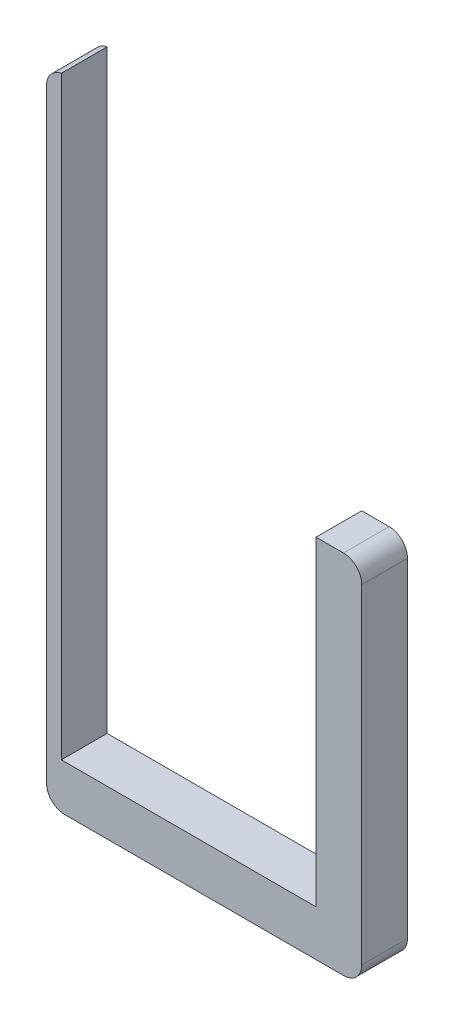
ISO-10303-21;
HEADER;
FILE_DESCRIPTION(('STEP AP214'),'2;1');
FILE_NAME('part.step','',(''),(''),'','','');
FILE_SCHEMA(('AUTOMOTIVE_DESIGN { 1 0 10303 214 1 1 1 1 }'));
ENDSEC;
DATA;
#1=APPLICATION_CONTEXT('core data for automotive mechanical design processes');
#2=APPLICATION_PROTOCOL_DEFINITION('international standard','automotive_design',2000,#1);
#3=PRODUCT_CONTEXT('',#1,'mechanical');
#4=PRODUCT('Part','Part','',(#3));
#5=PRODUCT_RELATED_PRODUCT_CATEGORY('part','',(#4));
#6=PRODUCT_DEFINITION_FORMATION('','',#4);
#7=PRODUCT_DEFINITION_CONTEXT('part definition',#1,'design');
#8=PRODUCT_DEFINITION('design','',#6,#7);
#9=PRODUCT_DEFINITION_SHAPE('','',#8);
#10=(LENGTH_UNIT() NAMED_UNIT(*) SI_UNIT(.MILLI.,.METRE.));
#11=(NAMED_UNIT(*) PLANE_ANGLE_UNIT() SI_UNIT($,.RADIAN.));
#12=(NAMED_UNIT(*) SI_UNIT($,.STERADIAN.) SOLID_ANGLE_UNIT());
#13=UNCERTAINTY_MEASURE_WITH_UNIT(LENGTH_MEASURE(1.E-05),#10,'distance_accuracy_value','');
#14=(GEOMETRIC_REPRESENTATION_CONTEXT(3) GLOBAL_UNCERTAINTY_ASSIGNED_CONTEXT((#13)) GLOBAL_UNIT_ASSIGNED_CONTEXT((#10,
#11,#12)) REPRESENTATION_CONTEXT('',''));
#15=CARTESIAN_POINT('',(0.,0.,0.));
#16=DIRECTION('',(0.,0.,1.));
#17=DIRECTION('',(1.,0.,0.));
#18=AXIS2_PLACEMENT_3D('',#15,#16,#17);
#19=CARTESIAN_POINT('',(0.,82.55,6.35));
#20=DIRECTION('',(-1.,0.,0.));
#21=DIRECTION('',(0.,-1.,0.));
#22=AXIS2_PLACEMENT_3D('',#19,#20,#21);
#23=PLANE('',#22);
#24=DIRECTION('',(0.,1.,0.));
#25=VECTOR('',#24,1.);
#26=CARTESIAN_POINT('',(0.,82.55,0.));
#27=LINE('',#26,#25);
#28=CARTESIAN_POINT('',(0.,0.,0.));
#29=VERTEX_POINT('',#28);
#30=CARTESIAN_POINT('',(0.,82.55,0.));
#31=VERTEX_POINT('',#30);
#32=EDGE_CURVE('E142',#29,#31,#27,.T.);
#33=ORIENTED_EDGE('',*,*,#32,.T.);
#34=DIRECTION('',(0.,0.,-1.));
#35=VECTOR('',#34,1.);
#36=CARTESIAN_POINT('',(0.,82.55,6.35));
#37=LINE('',#36,#35);
#38=CARTESIAN_POINT('',(0.,82.55,6.35));
#39=VERTEX_POINT('',#38);
#40=EDGE_CURVE('E140',#39,#31,#37,.T.);
#41=ORIENTED_EDGE('',*,*,#40,.F.);
#42=DIRECTION('',(0.,1.,0.));
#43=VECTOR('',#42,1.);
#44=CARTESIAN_POINT('',(0.,82.55,6.35));
#45=LINE('',#44,#43);
#46=CARTESIAN_POINT('',(0.,0.,6.35));
#47=VERTEX_POINT('',#46);
#48=EDGE_CURVE('E122',#47,#39,#45,.T.);
#49=ORIENTED_EDGE('',*,*,#48,.F.);
#50=DIRECTION('',(0.,0.,-1.));
#51=VECTOR('',#50,1.);
#52=CARTESIAN_POINT('',(0.,0.,6.35));
#53=LINE('',#52,#51);
#54=EDGE_CURVE('E200',#47,#29,#53,.T.);
#55=ORIENTED_EDGE('',*,*,#54,.T.);
#56=EDGE_LOOP('',(#33,#41,#49,#55));
#57=FACE_BOUND('',#56,.T.);
#58=ADVANCED_FACE('F39',(#57),#23,.F.);
#59=CARTESIAN_POINT('',(-2.05739999999998,-6.35000000000001,6.35));
#60=DIRECTION('',(1.,0.,0.));
#61=DIRECTION('',(0.,1.,0.));
#62=AXIS2_PLACEMENT_3D('',#59,#60,#61);
#63=PLANE('',#62);
#64=DIRECTION('',(0.,-1.,0.));
#65=VECTOR('',#64,1.);
#66=CARTESIAN_POINT('',(-2.05739999999998,-6.35000000000001,6.35));
#67=LINE('',#66,#65);
#68=CARTESIAN_POINT('',(-2.0574,80.0562684105943,6.35));
#69=VERTEX_POINT('',#68);
#70=CARTESIAN_POINT('',(-2.05739999999998,-3.81000000000001,6.35));
#71=VERTEX_POINT('',#70);
#72=EDGE_CURVE('E135',#69,#71,#67,.T.);
#73=ORIENTED_EDGE('',*,*,#72,.F.);
#74=DIRECTION('',(0.,0.,-1.));
#75=VECTOR('',#74,1.);
#76=CARTESIAN_POINT('',(-2.0574,80.0562684105943,6.35));
#77=LINE('',#76,#75);
#78=CARTESIAN_POINT('',(-2.0574,80.0562684105943,0.));
#79=VERTEX_POINT('',#78);
#80=EDGE_CURVE('E151',#69,#79,#77,.T.);
#81=ORIENTED_EDGE('',*,*,#80,.T.);
#82=DIRECTION('',(0.,-1.,0.));
#83=VECTOR('',#82,1.);
#84=CARTESIAN_POINT('',(-2.05739999999998,-6.35000000000001,0.));
#85=LINE('',#84,#83);
#86=CARTESIAN_POINT('',(-2.05739999999998,-3.81000000000001,0.));
#87=VERTEX_POINT('',#86);
#88=EDGE_CURVE('E171',#79,#87,#85,.T.);
#89=ORIENTED_EDGE('',*,*,#88,.T.);
#90=DIRECTION('',(0.,0.,-1.));
#91=VECTOR('',#90,1.);
#92=CARTESIAN_POINT('',(-2.05739999999998,-3.81000000000001,6.35));
#93=LINE('',#92,#91);
#94=EDGE_CURVE('E157',#87,#71,#93,.F.);
#95=ORIENTED_EDGE('',*,*,#94,.T.);
#96=EDGE_LOOP('',(#73,#81,#89,#95));
#97=FACE_BOUND('',#96,.T.);
#98=ADVANCED_FACE('F170',(#97),#63,.F.);
#99=CARTESIAN_POINT('',(41.7068,-6.35000000000002,6.35));
#100=DIRECTION('',(0.,1.,0.));
#101=DIRECTION('',(-1.,0.,0.));
#102=AXIS2_PLACEMENT_3D('',#99,#100,#101);
#103=PLANE('',#102);
#104=DIRECTION('',(1.,0.,0.));
#105=VECTOR('',#104,1.);
#106=CARTESIAN_POINT('',(41.7068,-6.35000000000002,6.35));
#107=LINE('',#106,#105);
#108=CARTESIAN_POINT('',(0.482600000000014,-6.35000000000001,6.35));
#109=VERTEX_POINT('',#108);
#110=CARTESIAN_POINT('',(39.1668,-6.35000000000002,6.35));
#111=VERTEX_POINT('',#110);
#112=EDGE_CURVE('E234',#109,#111,#107,.T.);
#113=ORIENTED_EDGE('',*,*,#112,.F.);
#114=DIRECTION('',(0.,0.,-1.));
#115=VECTOR('',#114,1.);
#116=CARTESIAN_POINT('',(0.482600000000014,-6.35000000000001,6.35));
#117=LINE('',#116,#115);
#118=CARTESIAN_POINT('',(0.482600000000014,-6.35000000000001,0.));
#119=VERTEX_POINT('',#118);
#120=EDGE_CURVE('E11',#109,#119,#117,.T.);
#121=ORIENTED_EDGE('',*,*,#120,.T.);
#122=DIRECTION('',(1.,0.,0.));
#123=VECTOR('',#122,1.);
#124=CARTESIAN_POINT('',(41.7068,-6.35000000000002,0.));
#125=LINE('',#124,#123);
#126=CARTESIAN_POINT('',(39.1668,-6.35000000000002,0.));
#127=VERTEX_POINT('',#126);
#128=EDGE_CURVE('E180',#119,#127,#125,.T.);
#129=ORIENTED_EDGE('',*,*,#128,.T.);
#130=DIRECTION('',(0.,0.,-1.));
#131=VECTOR('',#130,1.);
#132=CARTESIAN_POINT('',(39.1668,-6.35000000000002,6.35));
#133=LINE('',#132,#131);
#134=EDGE_CURVE('E48',#127,#111,#133,.F.);
#135=ORIENTED_EDGE('',*,*,#134,.T.);
#136=EDGE_LOOP('',(#113,#121,#129,#135));
#137=FACE_BOUND('',#136,.T.);
#138=ADVANCED_FACE('F244',(#137),#103,.F.);
#139=CARTESIAN_POINT('',(41.7068,44.45,6.35));
#140=DIRECTION('',(-1.,0.,0.));
#141=DIRECTION('',(0.,-1.,0.));
#142=AXIS2_PLACEMENT_3D('',#139,#140,#141);
#143=PLANE('',#142);
#144=DIRECTION('',(0.,1.,0.));
#145=VECTOR('',#144,1.);
#146=CARTESIAN_POINT('',(41.7068,44.45,0.));
#147=LINE('',#146,#145);
#148=CARTESIAN_POINT('',(41.7068,-3.81000000000002,0.));
#149=VERTEX_POINT('',#148);
#150=CARTESIAN_POINT('',(41.7068,41.91,0.));
#151=VERTEX_POINT('',#150);
#152=EDGE_CURVE('E184',#149,#151,#147,.T.);
#153=ORIENTED_EDGE('',*,*,#152,.T.);
#154=DIRECTION('',(0.,0.,-1.));
#155=VECTOR('',#154,1.);
#156=CARTESIAN_POINT('',(41.7068,41.91,6.35));
#157=LINE('',#156,#155);
#158=CARTESIAN_POINT('',(41.7068,41.91,6.35));
#159=VERTEX_POINT('',#158);
#160=EDGE_CURVE('E227',#151,#159,#157,.F.);
#161=ORIENTED_EDGE('',*,*,#160,.T.);
#162=DIRECTION('',(0.,1.,0.));
#163=VECTOR('',#162,1.);
#164=CARTESIAN_POINT('',(41.7068,44.45,6.35));
#165=LINE('',#164,#163);
#166=CARTESIAN_POINT('',(41.7068,-3.81000000000002,6.35));
#167=VERTEX_POINT('',#166);
#168=EDGE_CURVE('E232',#167,#159,#165,.T.);
#169=ORIENTED_EDGE('',*,*,#168,.F.);
#170=DIRECTION('',(0.,0.,-1.));
#171=VECTOR('',#170,1.);
#172=CARTESIAN_POINT('',(41.7068,-3.81000000000002,6.35));
#173=LINE('',#172,#171);
#174=EDGE_CURVE('E223',#167,#149,#173,.T.);
#175=ORIENTED_EDGE('',*,*,#174,.T.);
#176=EDGE_LOOP('',(#153,#161,#169,#175));
#177=FACE_BOUND('',#176,.T.);
#178=ADVANCED_FACE('F238',(#177),#143,.F.);
#179=CARTESIAN_POINT('',(35.3568,44.45,6.35));
#180=DIRECTION('',(0.,-1.,0.));
#181=DIRECTION('',(0.,0.,-1.));
#182=AXIS2_PLACEMENT_3D('',#179,#180,#181);
#183=PLANE('',#182);
#184=DIRECTION('',(-1.,0.,0.));
#185=VECTOR('',#184,1.);
#186=CARTESIAN_POINT('',(35.3568,44.45,6.35));
#187=LINE('',#186,#185);
#188=CARTESIAN_POINT('',(39.1668,44.45,6.35));
#189=VERTEX_POINT('',#188);
#190=CARTESIAN_POINT('',(35.3568,44.45,6.35));
#191=VERTEX_POINT('',#190);
#192=EDGE_CURVE('E242',#189,#191,#187,.T.);
#193=ORIENTED_EDGE('',*,*,#192,.F.);
#194=DIRECTION('',(0.,0.,-1.));
#195=VECTOR('',#194,1.);
#196=CARTESIAN_POINT('',(39.1668,44.45,6.35));
#197=LINE('',#196,#195);
#198=CARTESIAN_POINT('',(39.1668,44.45,0.));
#199=VERTEX_POINT('',#198);
#200=EDGE_CURVE('E145',#189,#199,#197,.T.);
#201=ORIENTED_EDGE('',*,*,#200,.T.);
#202=DIRECTION('',(-1.,0.,0.));
#203=VECTOR('',#202,1.);
#204=CARTESIAN_POINT('',(35.3568,44.45,0.));
#205=LINE('',#204,#203);
#206=CARTESIAN_POINT('',(35.3568,44.45,0.));
#207=VERTEX_POINT('',#206);
#208=EDGE_CURVE('E192',#199,#207,#205,.T.);
#209=ORIENTED_EDGE('',*,*,#208,.T.);
#210=DIRECTION('',(0.,0.,-1.));
#211=VECTOR('',#210,1.);
#212=CARTESIAN_POINT('',(35.3568,44.45,6.35));
#213=LINE('',#212,#211);
#214=EDGE_CURVE('E146',#191,#207,#213,.T.);
#215=ORIENTED_EDGE('',*,*,#214,.F.);
#216=EDGE_LOOP('',(#193,#201,#209,#215));
#217=FACE_BOUND('',#216,.T.);
#218=ADVANCED_FACE('F269',(#217),#183,.F.);
#219=CARTESIAN_POINT('',(35.3568,0.,6.35));
#220=DIRECTION('',(1.,0.,0.));
#221=DIRECTION('',(0.,1.,0.));
#222=AXIS2_PLACEMENT_3D('',#219,#220,#221);
#223=PLANE('',#222);
#224=DIRECTION('',(0.,-1.,0.));
#225=VECTOR('',#224,1.);
#226=CARTESIAN_POINT('',(35.3568,0.,0.));
#227=LINE('',#226,#225);
#228=CARTESIAN_POINT('',(35.3568,0.,0.));
#229=VERTEX_POINT('',#228);
#230=EDGE_CURVE('E195',#207,#229,#227,.T.);
#231=ORIENTED_EDGE('',*,*,#230,.T.);
#232=DIRECTION('',(0.,0.,-1.));
#233=VECTOR('',#232,1.);
#234=CARTESIAN_POINT('',(35.3568,0.,6.35));
#235=LINE('',#234,#233);
#236=CARTESIAN_POINT('',(35.3568,0.,6.35));
#237=VERTEX_POINT('',#236);
#238=EDGE_CURVE('E203',#237,#229,#235,.T.);
#239=ORIENTED_EDGE('',*,*,#238,.F.);
#240=DIRECTION('',(0.,-1.,0.));
#241=VECTOR('',#240,1.);
#242=CARTESIAN_POINT('',(35.3568,0.,6.35));
#243=LINE('',#242,#241);
#244=EDGE_CURVE('E255',#191,#237,#243,.T.);
#245=ORIENTED_EDGE('',*,*,#244,.F.);
#246=ORIENTED_EDGE('',*,*,#214,.T.);
#247=EDGE_LOOP('',(#231,#239,#245,#246));
#248=FACE_BOUND('',#247,.T.);
#249=ADVANCED_FACE('F263',(#248),#223,.F.);
#250=CARTESIAN_POINT('',(0.,0.,6.35));
#251=DIRECTION('',(0.,-1.,0.));
#252=DIRECTION('',(0.,0.,-1.));
#253=AXIS2_PLACEMENT_3D('',#250,#251,#252);
#254=PLANE('',#253);
#255=DIRECTION('',(-1.,0.,0.));
#256=VECTOR('',#255,1.);
#257=CARTESIAN_POINT('',(0.,0.,0.));
#258=LINE('',#257,#256);
#259=EDGE_CURVE('E136',#229,#29,#258,.T.);
#260=ORIENTED_EDGE('',*,*,#259,.T.);
#261=ORIENTED_EDGE('',*,*,#54,.F.);
#262=DIRECTION('',(-1.,0.,0.));
#263=VECTOR('',#262,1.);
#264=CARTESIAN_POINT('',(0.,0.,6.35));
#265=LINE('',#264,#263);
#266=EDGE_CURVE('E130',#237,#47,#265,.T.);
#267=ORIENTED_EDGE('',*,*,#266,.F.);
#268=ORIENTED_EDGE('',*,*,#238,.T.);
#269=EDGE_LOOP('',(#260,#261,#267,#268));
#270=FACE_BOUND('',#269,.T.);
#271=ADVANCED_FACE('F267',(#270),#254,.F.);
#272=CARTESIAN_POINT('',(0.,0.,6.35));
#273=DIRECTION('',(0.,0.,1.));
#274=DIRECTION('',(1.,0.,0.));
#275=AXIS2_PLACEMENT_3D('',#272,#273,#274);
#276=PLANE('',#275);
#277=ORIENTED_EDGE('',*,*,#168,.T.);
#278=CARTESIAN_POINT('',(39.1668,41.91,6.35));
#279=DIRECTION('',(0.,0.,1.));
#280=DIRECTION('',(1.,0.,0.));
#281=AXIS2_PLACEMENT_3D('',#278,#279,#280);
#282=CIRCLE('',#281,2.54);
#283=EDGE_CURVE('E153',#159,#189,#282,.T.);
#284=ORIENTED_EDGE('',*,*,#283,.T.);
#285=ORIENTED_EDGE('',*,*,#192,.T.);
#286=ORIENTED_EDGE('',*,*,#244,.T.);
#287=ORIENTED_EDGE('',*,*,#266,.T.);
#288=ORIENTED_EDGE('',*,*,#48,.T.);
#289=CARTESIAN_POINT('',(0.482599999999996,80.0562684105943,6.35));
#290=DIRECTION('',(0.,0.,1.));
#291=DIRECTION('',(1.,0.,0.));
#292=AXIS2_PLACEMENT_3D('',#289,#290,#291);
#293=CIRCLE('',#292,2.54);
#294=EDGE_CURVE('E127',#39,#69,#293,.T.);
#295=ORIENTED_EDGE('',*,*,#294,.T.);
#296=ORIENTED_EDGE('',*,*,#72,.T.);
#297=CARTESIAN_POINT('',(0.482600000000014,-3.81000000000001,6.35));
#298=DIRECTION('',(0.,0.,1.));
#299=DIRECTION('',(1.,0.,0.));
#300=AXIS2_PLACEMENT_3D('',#297,#298,#299);
#301=CIRCLE('',#300,2.54);
#302=EDGE_CURVE('E61',#71,#109,#301,.T.);
#303=ORIENTED_EDGE('',*,*,#302,.T.);
#304=ORIENTED_EDGE('',*,*,#112,.T.);
#305=CARTESIAN_POINT('',(39.1668,-3.81000000000002,6.35));
#306=DIRECTION('',(0.,0.,1.));
#307=DIRECTION('',(1.,0.,0.));
#308=AXIS2_PLACEMENT_3D('',#305,#306,#307);
#309=CIRCLE('',#308,2.54);
#310=EDGE_CURVE('E159',#111,#167,#309,.T.);
#311=ORIENTED_EDGE('',*,*,#310,.T.);
#312=EDGE_LOOP('',(#277,#284,#285,#286,#287,#288,#295,#296,#303,#304,#311));
#313=FACE_BOUND('',#312,.T.);
#314=ADVANCED_FACE('F125',(#313),#276,.T.);
#315=CARTESIAN_POINT('',(0.,0.,0.));
#316=DIRECTION('',(0.,0.,1.));
#317=DIRECTION('',(1.,0.,0.));
#318=AXIS2_PLACEMENT_3D('',#315,#316,#317);
#319=PLANE('',#318);
#320=ORIENTED_EDGE('',*,*,#208,.F.);
#321=CARTESIAN_POINT('',(39.1668,41.91,0.));
#322=DIRECTION('',(0.,0.,1.));
#323=DIRECTION('',(1.,0.,0.));
#324=AXIS2_PLACEMENT_3D('',#321,#322,#323);
#325=CIRCLE('',#324,2.54);
#326=EDGE_CURVE('E220',#199,#151,#325,.F.);
#327=ORIENTED_EDGE('',*,*,#326,.T.);
#328=ORIENTED_EDGE('',*,*,#152,.F.);
#329=CARTESIAN_POINT('',(39.1668,-3.81000000000002,0.));
#330=DIRECTION('',(0.,0.,1.));
#331=DIRECTION('',(1.,0.,0.));
#332=AXIS2_PLACEMENT_3D('',#329,#330,#331);
#333=CIRCLE('',#332,2.54);
#334=EDGE_CURVE('E213',#149,#127,#333,.F.);
#335=ORIENTED_EDGE('',*,*,#334,.T.);
#336=ORIENTED_EDGE('',*,*,#128,.F.);
#337=CARTESIAN_POINT('',(0.482600000000014,-3.81000000000001,0.));
#338=DIRECTION('',(0.,0.,1.));
#339=DIRECTION('',(1.,0.,0.));
#340=AXIS2_PLACEMENT_3D('',#337,#338,#339);
#341=CIRCLE('',#340,2.54);
#342=EDGE_CURVE('E178',#119,#87,#341,.F.);
#343=ORIENTED_EDGE('',*,*,#342,.T.);
#344=ORIENTED_EDGE('',*,*,#88,.F.);
#345=CARTESIAN_POINT('',(0.482599999999996,80.0562684105943,0.));
#346=DIRECTION('',(0.,0.,1.));
#347=DIRECTION('',(1.,0.,0.));
#348=AXIS2_PLACEMENT_3D('',#345,#346,#347);
#349=CIRCLE('',#348,2.54);
#350=EDGE_CURVE('E176',#79,#31,#349,.F.);
#351=ORIENTED_EDGE('',*,*,#350,.T.);
#352=ORIENTED_EDGE('',*,*,#32,.F.);
#353=ORIENTED_EDGE('',*,*,#259,.F.);
#354=ORIENTED_EDGE('',*,*,#230,.F.);
#355=EDGE_LOOP('',(#320,#327,#328,#335,#336,#343,#344,#351,#352,#353,#354));
#356=FACE_BOUND('',#355,.T.);
#357=ADVANCED_FACE('F175',(#356),#319,.F.);
#358=CARTESIAN_POINT('',(39.1668,41.91,6.35));
#359=DIRECTION('',(0.,0.,-1.));
#360=DIRECTION('',(-1.,0.,0.));
#361=AXIS2_PLACEMENT_3D('',#358,#359,#360);
#362=CYLINDRICAL_SURFACE('',#361,2.54);
#363=ORIENTED_EDGE('',*,*,#283,.F.);
#364=ORIENTED_EDGE('',*,*,#160,.F.);
#365=ORIENTED_EDGE('',*,*,#326,.F.);
#366=ORIENTED_EDGE('',*,*,#200,.F.);
#367=EDGE_LOOP('',(#363,#364,#365,#366));
#368=FACE_BOUND('',#367,.T.);
#369=ADVANCED_FACE('F272',(#368),#362,.T.);
#370=CARTESIAN_POINT('',(0.482599999999996,80.0562684105943,6.35));
#371=DIRECTION('',(0.,0.,-1.));
#372=DIRECTION('',(-1.,0.,0.));
#373=AXIS2_PLACEMENT_3D('',#370,#371,#372);
#374=CYLINDRICAL_SURFACE('',#373,2.54);
#375=ORIENTED_EDGE('',*,*,#294,.F.);
#376=ORIENTED_EDGE('',*,*,#40,.T.);
#377=ORIENTED_EDGE('',*,*,#350,.F.);
#378=ORIENTED_EDGE('',*,*,#80,.F.);
#379=EDGE_LOOP('',(#375,#376,#377,#378));
#380=FACE_BOUND('',#379,.T.);
#381=ADVANCED_FACE('F149',(#380),#374,.T.);
#382=CARTESIAN_POINT('',(0.482600000000014,-3.81000000000001,6.35));
#383=DIRECTION('',(0.,0.,-1.));
#384=DIRECTION('',(-1.,0.,0.));
#385=AXIS2_PLACEMENT_3D('',#382,#383,#384);
#386=CYLINDRICAL_SURFACE('',#385,2.54);
#387=ORIENTED_EDGE('',*,*,#302,.F.);
#388=ORIENTED_EDGE('',*,*,#94,.F.);
#389=ORIENTED_EDGE('',*,*,#342,.F.);
#390=ORIENTED_EDGE('',*,*,#120,.F.);
#391=EDGE_LOOP('',(#387,#388,#389,#390));
#392=FACE_BOUND('',#391,.T.);
#393=ADVANCED_FACE('F247',(#392),#386,.T.);
#394=CARTESIAN_POINT('',(39.1668,-3.81000000000002,6.35));
#395=DIRECTION('',(0.,0.,-1.));
#396=DIRECTION('',(-1.,0.,0.));
#397=AXIS2_PLACEMENT_3D('',#394,#395,#396);
#398=CYLINDRICAL_SURFACE('',#397,2.54);
#399=ORIENTED_EDGE('',*,*,#310,.F.);
#400=ORIENTED_EDGE('',*,*,#134,.F.);
#401=ORIENTED_EDGE('',*,*,#334,.F.);
#402=ORIENTED_EDGE('',*,*,#174,.F.);
#403=EDGE_LOOP('',(#399,#400,#401,#402));
#404=FACE_BOUND('',#403,.T.);
#405=ADVANCED_FACE('F41',(#404),#398,.T.);
#406=CLOSED_SHELL('',(#58,#98,#138,#178,#218,#249,#271,#314,#357,#369,#381,#393,#405));
#407=MANIFOLD_SOLID_BREP('B2',#406);
#408=ADVANCED_BREP_SHAPE_REPRESENTATION('',(#18,#407),#14);
#409=SHAPE_DEFINITION_REPRESENTATION(#9,#408);
ENDSEC;
END-ISO-10303-21;
